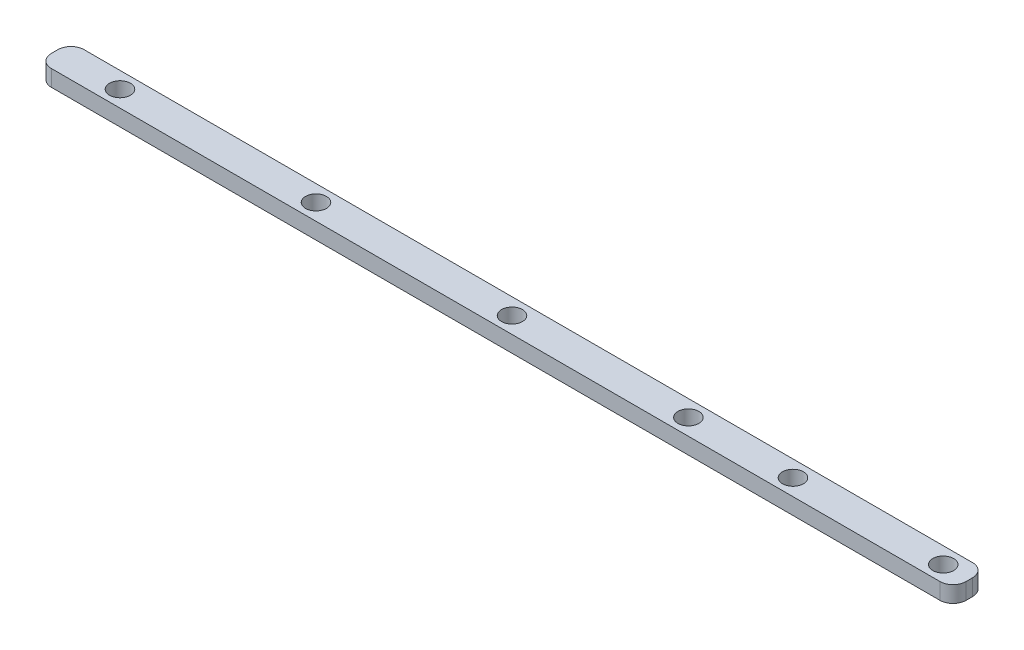
ISO-10303-21;
HEADER;
FILE_DESCRIPTION(('STEP AP214'),'2;1');
FILE_NAME('part.step','',(''),(''),'','','');
FILE_SCHEMA(('AUTOMOTIVE_DESIGN { 1 0 10303 214 1 1 1 1 }'));
ENDSEC;
DATA;
#1=APPLICATION_CONTEXT('core data for automotive mechanical design processes');
#2=APPLICATION_PROTOCOL_DEFINITION('international standard','automotive_design',2000,#1);
#3=PRODUCT_CONTEXT('',#1,'mechanical');
#4=PRODUCT('Part','Part','',(#3));
#5=PRODUCT_RELATED_PRODUCT_CATEGORY('part','',(#4));
#6=PRODUCT_DEFINITION_FORMATION('','',#4);
#7=PRODUCT_DEFINITION_CONTEXT('part definition',#1,'design');
#8=PRODUCT_DEFINITION('design','',#6,#7);
#9=PRODUCT_DEFINITION_SHAPE('','',#8);
#10=(LENGTH_UNIT() NAMED_UNIT(*) SI_UNIT(.MILLI.,.METRE.));
#11=(NAMED_UNIT(*) PLANE_ANGLE_UNIT() SI_UNIT($,.RADIAN.));
#12=(NAMED_UNIT(*) SI_UNIT($,.STERADIAN.) SOLID_ANGLE_UNIT());
#13=UNCERTAINTY_MEASURE_WITH_UNIT(LENGTH_MEASURE(1.E-05),#10,'distance_accuracy_value','');
#14=(GEOMETRIC_REPRESENTATION_CONTEXT(3) GLOBAL_UNCERTAINTY_ASSIGNED_CONTEXT((#13)) GLOBAL_UNIT_ASSIGNED_CONTEXT((#10,
#11,#12)) REPRESENTATION_CONTEXT('',''));
#15=CARTESIAN_POINT('',(0.,0.,0.));
#16=DIRECTION('',(0.,0.,1.));
#17=DIRECTION('',(1.,0.,0.));
#18=AXIS2_PLACEMENT_3D('',#15,#16,#17);
#19=CARTESIAN_POINT('',(-88.9,3.175,3.175));
#20=DIRECTION('',(0.,0.,-1.));
#21=DIRECTION('',(-1.,0.,0.));
#22=AXIS2_PLACEMENT_3D('',#19,#20,#21);
#23=PLANE('',#22);
#24=DIRECTION('',(1.,0.,0.));
#25=VECTOR('',#24,1.);
#26=CARTESIAN_POINT('',(-88.9,0.,3.175));
#27=LINE('',#26,#25);
#28=CARTESIAN_POINT('',(-86.36,0.,3.175));
#29=VERTEX_POINT('',#28);
#30=CARTESIAN_POINT('',(86.36,0.,3.175));
#31=VERTEX_POINT('',#30);
#32=EDGE_CURVE('E183',#29,#31,#27,.T.);
#33=ORIENTED_EDGE('',*,*,#32,.T.);
#34=DIRECTION('',(0.,-1.,0.));
#35=VECTOR('',#34,1.);
#36=CARTESIAN_POINT('',(86.36,3.175,3.175));
#37=LINE('',#36,#35);
#38=CARTESIAN_POINT('',(86.36,3.175,3.175));
#39=VERTEX_POINT('',#38);
#40=EDGE_CURVE('E173',#31,#39,#37,.F.);
#41=ORIENTED_EDGE('',*,*,#40,.T.);
#42=DIRECTION('',(1.,0.,0.));
#43=VECTOR('',#42,1.);
#44=CARTESIAN_POINT('',(-88.9,3.175,3.175));
#45=LINE('',#44,#43);
#46=CARTESIAN_POINT('',(-86.36,3.175,3.175));
#47=VERTEX_POINT('',#46);
#48=EDGE_CURVE('E189',#47,#39,#45,.T.);
#49=ORIENTED_EDGE('',*,*,#48,.F.);
#50=DIRECTION('',(0.,-1.,0.));
#51=VECTOR('',#50,1.);
#52=CARTESIAN_POINT('',(-86.36,0.,3.175));
#53=LINE('',#52,#51);
#54=EDGE_CURVE('E169',#47,#29,#53,.T.);
#55=ORIENTED_EDGE('',*,*,#54,.T.);
#56=EDGE_LOOP('',(#33,#41,#49,#55));
#57=FACE_BOUND('',#56,.T.);
#58=ADVANCED_FACE('F43',(#57),#23,.F.);
#59=CARTESIAN_POINT('',(88.9,3.175,3.175));
#60=DIRECTION('',(-1.,0.,0.));
#61=DIRECTION('',(0.,0.,1.));
#62=AXIS2_PLACEMENT_3D('',#59,#60,#61);
#63=PLANE('',#62);
#64=DIRECTION('',(0.,0.,-1.));
#65=VECTOR('',#64,1.);
#66=CARTESIAN_POINT('',(88.9,0.,3.175));
#67=LINE('',#66,#65);
#68=CARTESIAN_POINT('',(88.9,0.,0.634999999999999));
#69=VERTEX_POINT('',#68);
#70=CARTESIAN_POINT('',(88.9,0.,-0.635));
#71=VERTEX_POINT('',#70);
#72=EDGE_CURVE('E131',#69,#71,#67,.T.);
#73=ORIENTED_EDGE('',*,*,#72,.T.);
#74=DIRECTION('',(0.,-1.,0.));
#75=VECTOR('',#74,1.);
#76=CARTESIAN_POINT('',(88.9,3.175,-0.635));
#77=LINE('',#76,#75);
#78=CARTESIAN_POINT('',(88.9,3.175,-0.635));
#79=VERTEX_POINT('',#78);
#80=EDGE_CURVE('E156',#71,#79,#77,.F.);
#81=ORIENTED_EDGE('',*,*,#80,.T.);
#82=DIRECTION('',(0.,0.,-1.));
#83=VECTOR('',#82,1.);
#84=CARTESIAN_POINT('',(88.9,3.175,3.175));
#85=LINE('',#84,#83);
#86=CARTESIAN_POINT('',(88.9,3.175,0.634999999999999));
#87=VERTEX_POINT('',#86);
#88=EDGE_CURVE('E203',#87,#79,#85,.T.);
#89=ORIENTED_EDGE('',*,*,#88,.F.);
#90=DIRECTION('',(0.,-1.,0.));
#91=VECTOR('',#90,1.);
#92=CARTESIAN_POINT('',(88.9,3.175,0.634999999999999));
#93=LINE('',#92,#91);
#94=EDGE_CURVE('E155',#87,#69,#93,.T.);
#95=ORIENTED_EDGE('',*,*,#94,.T.);
#96=EDGE_LOOP('',(#73,#81,#89,#95));
#97=FACE_BOUND('',#96,.T.);
#98=ADVANCED_FACE('F262',(#97),#63,.F.);
#99=CARTESIAN_POINT('',(-88.9,3.175,-3.175));
#100=DIRECTION('',(0.,0.,-1.));
#101=DIRECTION('',(-1.,0.,0.));
#102=AXIS2_PLACEMENT_3D('',#99,#100,#101);
#103=PLANE('',#102);
#104=DIRECTION('',(1.,0.,0.));
#105=VECTOR('',#104,1.);
#106=CARTESIAN_POINT('',(-88.9,3.175,-3.175));
#107=LINE('',#106,#105);
#108=CARTESIAN_POINT('',(-86.36,3.175,-3.175));
#109=VERTEX_POINT('',#108);
#110=CARTESIAN_POINT('',(86.36,3.175,-3.175));
#111=VERTEX_POINT('',#110);
#112=EDGE_CURVE('E143',#109,#111,#107,.T.);
#113=ORIENTED_EDGE('',*,*,#112,.T.);
#114=DIRECTION('',(0.,-1.,0.));
#115=VECTOR('',#114,1.);
#116=CARTESIAN_POINT('',(86.36,0.,-3.175));
#117=LINE('',#116,#115);
#118=CARTESIAN_POINT('',(86.36,0.,-3.175));
#119=VERTEX_POINT('',#118);
#120=EDGE_CURVE('E127',#111,#119,#117,.T.);
#121=ORIENTED_EDGE('',*,*,#120,.T.);
#122=DIRECTION('',(1.,0.,0.));
#123=VECTOR('',#122,1.);
#124=CARTESIAN_POINT('',(-88.9,0.,-3.175));
#125=LINE('',#124,#123);
#126=CARTESIAN_POINT('',(-86.36,0.,-3.175));
#127=VERTEX_POINT('',#126);
#128=EDGE_CURVE('E120',#127,#119,#125,.T.);
#129=ORIENTED_EDGE('',*,*,#128,.F.);
#130=DIRECTION('',(0.,-1.,0.));
#131=VECTOR('',#130,1.);
#132=CARTESIAN_POINT('',(-86.36,3.175,-3.175));
#133=LINE('',#132,#131);
#134=EDGE_CURVE('E134',#127,#109,#133,.F.);
#135=ORIENTED_EDGE('',*,*,#134,.T.);
#136=EDGE_LOOP('',(#113,#121,#129,#135));
#137=FACE_BOUND('',#136,.T.);
#138=ADVANCED_FACE('F133',(#137),#103,.T.);
#139=CARTESIAN_POINT('',(-88.9,3.175,3.175));
#140=DIRECTION('',(-1.,0.,0.));
#141=DIRECTION('',(0.,0.,1.));
#142=AXIS2_PLACEMENT_3D('',#139,#140,#141);
#143=PLANE('',#142);
#144=DIRECTION('',(0.,0.,-1.));
#145=VECTOR('',#144,1.);
#146=CARTESIAN_POINT('',(-88.9,0.,3.175));
#147=LINE('',#146,#145);
#148=CARTESIAN_POINT('',(-88.9,0.,0.634999999999999));
#149=VERTEX_POINT('',#148);
#150=CARTESIAN_POINT('',(-88.9,0.,-0.635));
#151=VERTEX_POINT('',#150);
#152=EDGE_CURVE('E116',#149,#151,#147,.T.);
#153=ORIENTED_EDGE('',*,*,#152,.F.);
#154=DIRECTION('',(0.,-1.,0.));
#155=VECTOR('',#154,1.);
#156=CARTESIAN_POINT('',(-88.9,3.175,0.634999999999999));
#157=LINE('',#156,#155);
#158=CARTESIAN_POINT('',(-88.9,3.175,0.634999999999999));
#159=VERTEX_POINT('',#158);
#160=EDGE_CURVE('E11',#149,#159,#157,.F.);
#161=ORIENTED_EDGE('',*,*,#160,.T.);
#162=DIRECTION('',(0.,0.,-1.));
#163=VECTOR('',#162,1.);
#164=CARTESIAN_POINT('',(-88.9,3.175,3.175));
#165=LINE('',#164,#163);
#166=CARTESIAN_POINT('',(-88.9,3.175,-0.635));
#167=VERTEX_POINT('',#166);
#168=EDGE_CURVE('E139',#159,#167,#165,.T.);
#169=ORIENTED_EDGE('',*,*,#168,.T.);
#170=DIRECTION('',(0.,-1.,0.));
#171=VECTOR('',#170,1.);
#172=CARTESIAN_POINT('',(-88.9,3.175,-0.635));
#173=LINE('',#172,#171);
#174=EDGE_CURVE('E51',#167,#151,#173,.T.);
#175=ORIENTED_EDGE('',*,*,#174,.T.);
#176=EDGE_LOOP('',(#153,#161,#169,#175));
#177=FACE_BOUND('',#176,.T.);
#178=ADVANCED_FACE('F172',(#177),#143,.T.);
#179=CARTESIAN_POINT('',(0.,3.175,0.));
#180=DIRECTION('',(0.,1.,0.));
#181=DIRECTION('',(0.,0.,1.));
#182=AXIS2_PLACEMENT_3D('',#179,#180,#181);
#183=PLANE('',#182);
#184=CARTESIAN_POINT('',(-76.2,3.175,0.));
#185=DIRECTION('',(0.,1.,0.));
#186=DIRECTION('',(0.,0.,1.));
#187=AXIS2_PLACEMENT_3D('',#184,#185,#186);
#188=CIRCLE('',#187,2.03200000000001);
#189=CARTESIAN_POINT('',(-76.2,3.175,2.03200000000001));
#190=VERTEX_POINT('',#189);
#191=EDGE_CURVE('E208',#190,#190,#188,.T.);
#192=ORIENTED_EDGE('',*,*,#191,.F.);
#193=EDGE_LOOP('',(#192));
#194=FACE_BOUND('',#193,.T.);
#195=CARTESIAN_POINT('',(-38.1,3.175,0.));
#196=DIRECTION('',(0.,1.,0.));
#197=DIRECTION('',(0.,0.,1.));
#198=AXIS2_PLACEMENT_3D('',#195,#196,#197);
#199=CIRCLE('',#198,2.032);
#200=CARTESIAN_POINT('',(-38.1,3.175,2.032));
#201=VERTEX_POINT('',#200);
#202=EDGE_CURVE('E223',#201,#201,#199,.T.);
#203=ORIENTED_EDGE('',*,*,#202,.F.);
#204=EDGE_LOOP('',(#203));
#205=FACE_BOUND('',#204,.T.);
#206=CARTESIAN_POINT('',(83.82,3.175,0.));
#207=DIRECTION('',(0.,1.,0.));
#208=DIRECTION('',(0.,0.,1.));
#209=AXIS2_PLACEMENT_3D('',#206,#207,#208);
#210=CIRCLE('',#209,2.03200000000001);
#211=CARTESIAN_POINT('',(83.82,3.175,2.03200000000001));
#212=VERTEX_POINT('',#211);
#213=EDGE_CURVE('E220',#212,#212,#210,.T.);
#214=ORIENTED_EDGE('',*,*,#213,.F.);
#215=EDGE_LOOP('',(#214));
#216=FACE_BOUND('',#215,.T.);
#217=CARTESIAN_POINT('',(54.61,3.175,0.));
#218=DIRECTION('',(0.,1.,0.));
#219=DIRECTION('',(0.,0.,1.));
#220=AXIS2_PLACEMENT_3D('',#217,#218,#219);
#221=CIRCLE('',#220,2.032);
#222=CARTESIAN_POINT('',(54.61,3.175,2.032));
#223=VERTEX_POINT('',#222);
#224=EDGE_CURVE('E207',#223,#223,#221,.T.);
#225=ORIENTED_EDGE('',*,*,#224,.F.);
#226=EDGE_LOOP('',(#225));
#227=FACE_BOUND('',#226,.T.);
#228=CARTESIAN_POINT('',(34.29,3.175,0.));
#229=DIRECTION('',(0.,1.,0.));
#230=DIRECTION('',(0.,0.,1.));
#231=AXIS2_PLACEMENT_3D('',#228,#229,#230);
#232=CIRCLE('',#231,2.032);
#233=CARTESIAN_POINT('',(34.29,3.175,2.032));
#234=VERTEX_POINT('',#233);
#235=EDGE_CURVE('E216',#234,#234,#232,.T.);
#236=ORIENTED_EDGE('',*,*,#235,.F.);
#237=EDGE_LOOP('',(#236));
#238=FACE_BOUND('',#237,.T.);
#239=CARTESIAN_POINT('',(0.,3.175,0.));
#240=DIRECTION('',(0.,1.,0.));
#241=DIRECTION('',(0.,0.,1.));
#242=AXIS2_PLACEMENT_3D('',#239,#240,#241);
#243=CIRCLE('',#242,2.032);
#244=CARTESIAN_POINT('',(0.,3.175,2.032));
#245=VERTEX_POINT('',#244);
#246=EDGE_CURVE('E198',#245,#245,#243,.T.);
#247=ORIENTED_EDGE('',*,*,#246,.F.);
#248=EDGE_LOOP('',(#247));
#249=FACE_BOUND('',#248,.T.);
#250=ORIENTED_EDGE('',*,*,#88,.T.);
#251=CARTESIAN_POINT('',(86.36,3.175,-0.635));
#252=DIRECTION('',(0.,1.,0.));
#253=DIRECTION('',(0.,0.,1.));
#254=AXIS2_PLACEMENT_3D('',#251,#252,#253);
#255=CIRCLE('',#254,2.54);
#256=EDGE_CURVE('E164',#79,#111,#255,.T.);
#257=ORIENTED_EDGE('',*,*,#256,.T.);
#258=ORIENTED_EDGE('',*,*,#112,.F.);
#259=CARTESIAN_POINT('',(-86.36,3.175,-0.635));
#260=DIRECTION('',(0.,1.,0.));
#261=DIRECTION('',(0.,0.,1.));
#262=AXIS2_PLACEMENT_3D('',#259,#260,#261);
#263=CIRCLE('',#262,2.54);
#264=EDGE_CURVE('E59',#109,#167,#263,.T.);
#265=ORIENTED_EDGE('',*,*,#264,.T.);
#266=ORIENTED_EDGE('',*,*,#168,.F.);
#267=CARTESIAN_POINT('',(-86.36,3.175,0.634999999999999));
#268=DIRECTION('',(0.,1.,0.));
#269=DIRECTION('',(0.,0.,1.));
#270=AXIS2_PLACEMENT_3D('',#267,#268,#269);
#271=CIRCLE('',#270,2.54);
#272=EDGE_CURVE('E159',#159,#47,#271,.T.);
#273=ORIENTED_EDGE('',*,*,#272,.T.);
#274=ORIENTED_EDGE('',*,*,#48,.T.);
#275=CARTESIAN_POINT('',(86.36,3.175,0.634999999999999));
#276=DIRECTION('',(0.,1.,0.));
#277=DIRECTION('',(0.,0.,1.));
#278=AXIS2_PLACEMENT_3D('',#275,#276,#277);
#279=CIRCLE('',#278,2.54);
#280=EDGE_CURVE('E165',#39,#87,#279,.T.);
#281=ORIENTED_EDGE('',*,*,#280,.T.);
#282=EDGE_LOOP('',(#250,#257,#258,#265,#266,#273,#274,#281));
#283=FACE_BOUND('',#282,.T.);
#284=ADVANCED_FACE('F177',(#194,#205,#216,#227,#238,#249,#283),#183,.T.);
#285=CARTESIAN_POINT('',(0.,0.,0.));
#286=DIRECTION('',(0.,1.,0.));
#287=DIRECTION('',(0.,0.,1.));
#288=AXIS2_PLACEMENT_3D('',#285,#286,#287);
#289=PLANE('',#288);
#290=CARTESIAN_POINT('',(-76.2,0.,0.));
#291=DIRECTION('',(0.,1.,0.));
#292=DIRECTION('',(0.,0.,1.));
#293=AXIS2_PLACEMENT_3D('',#290,#291,#292);
#294=CIRCLE('',#293,2.03200000000001);
#295=CARTESIAN_POINT('',(-76.2,0.,2.03200000000001));
#296=VERTEX_POINT('',#295);
#297=EDGE_CURVE('E227',#296,#296,#294,.F.);
#298=ORIENTED_EDGE('',*,*,#297,.F.);
#299=EDGE_LOOP('',(#298));
#300=FACE_BOUND('',#299,.T.);
#301=CARTESIAN_POINT('',(-38.1,0.,0.));
#302=DIRECTION('',(0.,1.,0.));
#303=DIRECTION('',(0.,0.,1.));
#304=AXIS2_PLACEMENT_3D('',#301,#302,#303);
#305=CIRCLE('',#304,2.032);
#306=CARTESIAN_POINT('',(-38.1,0.,2.032));
#307=VERTEX_POINT('',#306);
#308=EDGE_CURVE('E222',#307,#307,#305,.F.);
#309=ORIENTED_EDGE('',*,*,#308,.F.);
#310=EDGE_LOOP('',(#309));
#311=FACE_BOUND('',#310,.T.);
#312=CARTESIAN_POINT('',(83.82,0.,0.));
#313=DIRECTION('',(0.,1.,0.));
#314=DIRECTION('',(0.,0.,1.));
#315=AXIS2_PLACEMENT_3D('',#312,#313,#314);
#316=CIRCLE('',#315,2.03200000000001);
#317=CARTESIAN_POINT('',(83.82,0.,2.03200000000001));
#318=VERTEX_POINT('',#317);
#319=EDGE_CURVE('E215',#318,#318,#316,.F.);
#320=ORIENTED_EDGE('',*,*,#319,.F.);
#321=EDGE_LOOP('',(#320));
#322=FACE_BOUND('',#321,.T.);
#323=CARTESIAN_POINT('',(54.61,0.,0.));
#324=DIRECTION('',(0.,1.,0.));
#325=DIRECTION('',(0.,0.,1.));
#326=AXIS2_PLACEMENT_3D('',#323,#324,#325);
#327=CIRCLE('',#326,2.032);
#328=CARTESIAN_POINT('',(54.61,0.,2.032));
#329=VERTEX_POINT('',#328);
#330=EDGE_CURVE('E213',#329,#329,#327,.F.);
#331=ORIENTED_EDGE('',*,*,#330,.F.);
#332=EDGE_LOOP('',(#331));
#333=FACE_BOUND('',#332,.T.);
#334=CARTESIAN_POINT('',(34.29,0.,0.));
#335=DIRECTION('',(0.,1.,0.));
#336=DIRECTION('',(0.,0.,1.));
#337=AXIS2_PLACEMENT_3D('',#334,#335,#336);
#338=CIRCLE('',#337,2.032);
#339=CARTESIAN_POINT('',(34.29,0.,2.032));
#340=VERTEX_POINT('',#339);
#341=EDGE_CURVE('E240',#340,#340,#338,.F.);
#342=ORIENTED_EDGE('',*,*,#341,.F.);
#343=EDGE_LOOP('',(#342));
#344=FACE_BOUND('',#343,.T.);
#345=CARTESIAN_POINT('',(0.,0.,0.));
#346=DIRECTION('',(0.,1.,0.));
#347=DIRECTION('',(0.,0.,1.));
#348=AXIS2_PLACEMENT_3D('',#345,#346,#347);
#349=CIRCLE('',#348,2.032);
#350=CARTESIAN_POINT('',(0.,0.,2.032));
#351=VERTEX_POINT('',#350);
#352=EDGE_CURVE('E186',#351,#351,#349,.F.);
#353=ORIENTED_EDGE('',*,*,#352,.F.);
#354=EDGE_LOOP('',(#353));
#355=FACE_BOUND('',#354,.T.);
#356=ORIENTED_EDGE('',*,*,#128,.T.);
#357=CARTESIAN_POINT('',(86.36,0.,-0.635));
#358=DIRECTION('',(0.,1.,0.));
#359=DIRECTION('',(0.,0.,1.));
#360=AXIS2_PLACEMENT_3D('',#357,#358,#359);
#361=CIRCLE('',#360,2.54);
#362=EDGE_CURVE('E149',#119,#71,#361,.F.);
#363=ORIENTED_EDGE('',*,*,#362,.T.);
#364=ORIENTED_EDGE('',*,*,#72,.F.);
#365=CARTESIAN_POINT('',(86.36,0.,0.634999999999999));
#366=DIRECTION('',(0.,1.,0.));
#367=DIRECTION('',(0.,0.,1.));
#368=AXIS2_PLACEMENT_3D('',#365,#366,#367);
#369=CIRCLE('',#368,2.54);
#370=EDGE_CURVE('E148',#69,#31,#369,.F.);
#371=ORIENTED_EDGE('',*,*,#370,.T.);
#372=ORIENTED_EDGE('',*,*,#32,.F.);
#373=CARTESIAN_POINT('',(-86.36,0.,0.634999999999999));
#374=DIRECTION('',(0.,1.,0.));
#375=DIRECTION('',(0.,0.,1.));
#376=AXIS2_PLACEMENT_3D('',#373,#374,#375);
#377=CIRCLE('',#376,2.54);
#378=EDGE_CURVE('E123',#29,#149,#377,.F.);
#379=ORIENTED_EDGE('',*,*,#378,.T.);
#380=ORIENTED_EDGE('',*,*,#152,.T.);
#381=CARTESIAN_POINT('',(-86.36,0.,-0.635));
#382=DIRECTION('',(0.,1.,0.));
#383=DIRECTION('',(0.,0.,1.));
#384=AXIS2_PLACEMENT_3D('',#381,#382,#383);
#385=CIRCLE('',#384,2.54);
#386=EDGE_CURVE('E118',#151,#127,#385,.F.);
#387=ORIENTED_EDGE('',*,*,#386,.T.);
#388=EDGE_LOOP('',(#356,#363,#364,#371,#372,#379,#380,#387));
#389=FACE_BOUND('',#388,.T.);
#390=ADVANCED_FACE('F117',(#300,#311,#322,#333,#344,#355,#389),#289,.F.);
#391=CARTESIAN_POINT('',(86.36,3.175,-0.635));
#392=DIRECTION('',(0.,1.,0.));
#393=DIRECTION('',(0.,0.,1.));
#394=AXIS2_PLACEMENT_3D('',#391,#392,#393);
#395=CYLINDRICAL_SURFACE('',#394,2.54);
#396=ORIENTED_EDGE('',*,*,#256,.F.);
#397=ORIENTED_EDGE('',*,*,#80,.F.);
#398=ORIENTED_EDGE('',*,*,#362,.F.);
#399=ORIENTED_EDGE('',*,*,#120,.F.);
#400=EDGE_LOOP('',(#396,#397,#398,#399));
#401=FACE_BOUND('',#400,.T.);
#402=ADVANCED_FACE('F241',(#401),#395,.T.);
#403=CARTESIAN_POINT('',(86.36,3.175,0.634999999999999));
#404=DIRECTION('',(0.,-1.,0.));
#405=DIRECTION('',(0.,0.,-1.));
#406=AXIS2_PLACEMENT_3D('',#403,#404,#405);
#407=CYLINDRICAL_SURFACE('',#406,2.54);
#408=ORIENTED_EDGE('',*,*,#280,.F.);
#409=ORIENTED_EDGE('',*,*,#40,.F.);
#410=ORIENTED_EDGE('',*,*,#370,.F.);
#411=ORIENTED_EDGE('',*,*,#94,.F.);
#412=EDGE_LOOP('',(#408,#409,#410,#411));
#413=FACE_BOUND('',#412,.T.);
#414=ADVANCED_FACE('F274',(#413),#407,.T.);
#415=CARTESIAN_POINT('',(-86.36,3.175,0.634999999999999));
#416=DIRECTION('',(0.,1.,0.));
#417=DIRECTION('',(0.,0.,1.));
#418=AXIS2_PLACEMENT_3D('',#415,#416,#417);
#419=CYLINDRICAL_SURFACE('',#418,2.54);
#420=ORIENTED_EDGE('',*,*,#272,.F.);
#421=ORIENTED_EDGE('',*,*,#160,.F.);
#422=ORIENTED_EDGE('',*,*,#378,.F.);
#423=ORIENTED_EDGE('',*,*,#54,.F.);
#424=EDGE_LOOP('',(#420,#421,#422,#423));
#425=FACE_BOUND('',#424,.T.);
#426=ADVANCED_FACE('F182',(#425),#419,.T.);
#427=CARTESIAN_POINT('',(-86.36,3.175,-0.635));
#428=DIRECTION('',(0.,-1.,0.));
#429=DIRECTION('',(0.,0.,-1.));
#430=AXIS2_PLACEMENT_3D('',#427,#428,#429);
#431=CYLINDRICAL_SURFACE('',#430,2.54);
#432=ORIENTED_EDGE('',*,*,#264,.F.);
#433=ORIENTED_EDGE('',*,*,#134,.F.);
#434=ORIENTED_EDGE('',*,*,#386,.F.);
#435=ORIENTED_EDGE('',*,*,#174,.F.);
#436=EDGE_LOOP('',(#432,#433,#434,#435));
#437=FACE_BOUND('',#436,.T.);
#438=ADVANCED_FACE('F44',(#437),#431,.T.);
#439=CARTESIAN_POINT('',(0.,-0.00100000000000013,0.));
#440=DIRECTION('',(0.,1.,0.));
#441=DIRECTION('',(0.,0.,1.));
#442=AXIS2_PLACEMENT_3D('',#439,#440,#441);
#443=CYLINDRICAL_SURFACE('',#442,2.032);
#444=ORIENTED_EDGE('',*,*,#246,.T.);
#445=EDGE_LOOP('',(#444));
#446=FACE_BOUND('',#445,.T.);
#447=ORIENTED_EDGE('',*,*,#352,.T.);
#448=EDGE_LOOP('',(#447));
#449=FACE_BOUND('',#448,.T.);
#450=ADVANCED_FACE('F248',(#446,#449),#443,.F.);
#451=CARTESIAN_POINT('',(34.29,-0.00100000000000013,0.));
#452=DIRECTION('',(0.,1.,0.));
#453=DIRECTION('',(0.,0.,1.));
#454=AXIS2_PLACEMENT_3D('',#451,#452,#453);
#455=CYLINDRICAL_SURFACE('',#454,2.032);
#456=ORIENTED_EDGE('',*,*,#235,.T.);
#457=EDGE_LOOP('',(#456));
#458=FACE_BOUND('',#457,.T.);
#459=ORIENTED_EDGE('',*,*,#341,.T.);
#460=EDGE_LOOP('',(#459));
#461=FACE_BOUND('',#460,.T.);
#462=ADVANCED_FACE('F243',(#458,#461),#455,.F.);
#463=CARTESIAN_POINT('',(54.61,-0.00100000000000013,0.));
#464=DIRECTION('',(0.,1.,0.));
#465=DIRECTION('',(0.,0.,1.));
#466=AXIS2_PLACEMENT_3D('',#463,#464,#465);
#467=CYLINDRICAL_SURFACE('',#466,2.032);
#468=ORIENTED_EDGE('',*,*,#224,.T.);
#469=EDGE_LOOP('',(#468));
#470=FACE_BOUND('',#469,.T.);
#471=ORIENTED_EDGE('',*,*,#330,.T.);
#472=EDGE_LOOP('',(#471));
#473=FACE_BOUND('',#472,.T.);
#474=ADVANCED_FACE('F260',(#470,#473),#467,.F.);
#475=CARTESIAN_POINT('',(83.82,-0.00100000000000013,0.));
#476=DIRECTION('',(0.,1.,0.));
#477=DIRECTION('',(0.,0.,1.));
#478=AXIS2_PLACEMENT_3D('',#475,#476,#477);
#479=CYLINDRICAL_SURFACE('',#478,2.03200000000001);
#480=ORIENTED_EDGE('',*,*,#213,.T.);
#481=EDGE_LOOP('',(#480));
#482=FACE_BOUND('',#481,.T.);
#483=ORIENTED_EDGE('',*,*,#319,.T.);
#484=EDGE_LOOP('',(#483));
#485=FACE_BOUND('',#484,.T.);
#486=ADVANCED_FACE('F334',(#482,#485),#479,.F.);
#487=CARTESIAN_POINT('',(-38.1,-0.00100000000000013,0.));
#488=DIRECTION('',(0.,1.,0.));
#489=DIRECTION('',(0.,0.,1.));
#490=AXIS2_PLACEMENT_3D('',#487,#488,#489);
#491=CYLINDRICAL_SURFACE('',#490,2.032);
#492=ORIENTED_EDGE('',*,*,#202,.T.);
#493=EDGE_LOOP('',(#492));
#494=FACE_BOUND('',#493,.T.);
#495=ORIENTED_EDGE('',*,*,#308,.T.);
#496=EDGE_LOOP('',(#495));
#497=FACE_BOUND('',#496,.T.);
#498=ADVANCED_FACE('F342',(#494,#497),#491,.F.);
#499=CARTESIAN_POINT('',(-76.2,-0.00100000000000013,0.));
#500=DIRECTION('',(0.,1.,0.));
#501=DIRECTION('',(0.,0.,1.));
#502=AXIS2_PLACEMENT_3D('',#499,#500,#501);
#503=CYLINDRICAL_SURFACE('',#502,2.03200000000001);
#504=ORIENTED_EDGE('',*,*,#191,.T.);
#505=EDGE_LOOP('',(#504));
#506=FACE_BOUND('',#505,.T.);
#507=ORIENTED_EDGE('',*,*,#297,.T.);
#508=EDGE_LOOP('',(#507));
#509=FACE_BOUND('',#508,.T.);
#510=ADVANCED_FACE('F348',(#506,#509),#503,.F.);
#511=CLOSED_SHELL('',(#58,#98,#138,#178,#284,#390,#402,#414,#426,#438,#450,#462,#474,#486,#498,#510));
#512=MANIFOLD_SOLID_BREP('B2',#511);
#513=ADVANCED_BREP_SHAPE_REPRESENTATION('',(#18,#512),#14);
#514=SHAPE_DEFINITION_REPRESENTATION(#9,#513);
ENDSEC;
END-ISO-10303-21;
